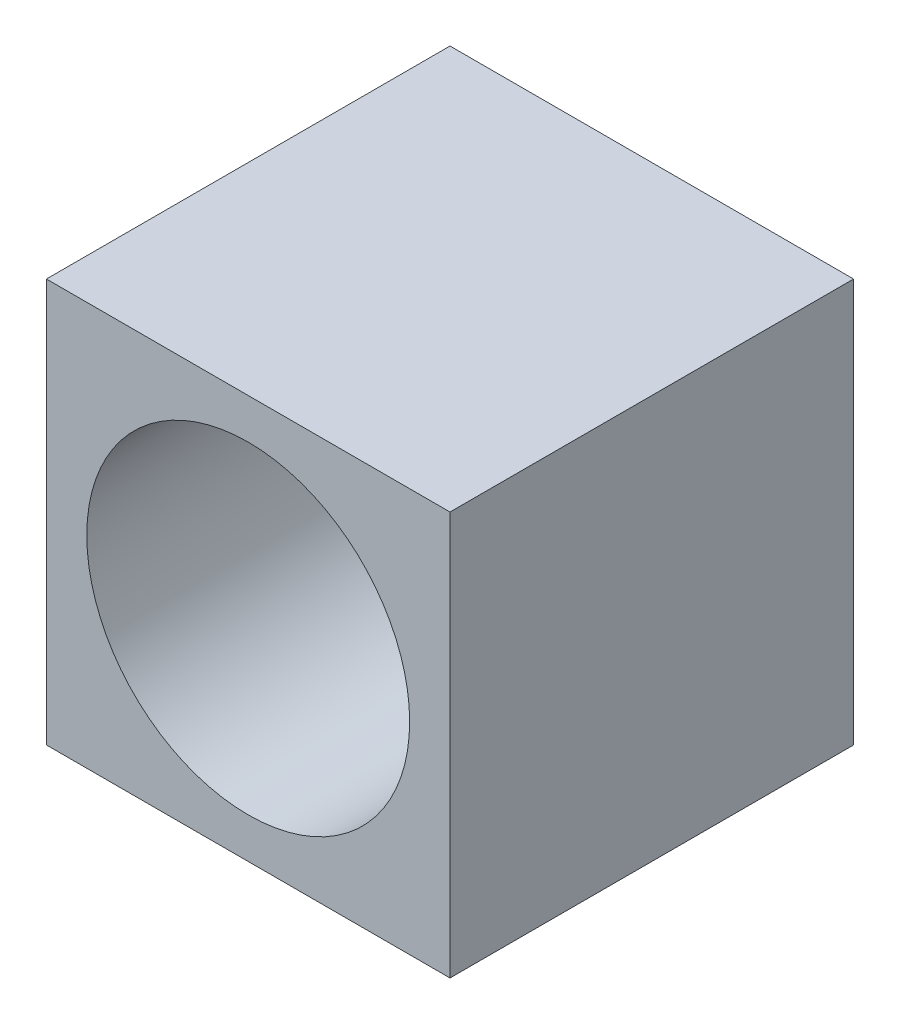
ISO-10303-21;
HEADER;
FILE_DESCRIPTION(('STEP AP214'),'2;1');
FILE_NAME('part.step','',(''),(''),'','','');
FILE_SCHEMA(('AUTOMOTIVE_DESIGN { 1 0 10303 214 1 1 1 1 }'));
ENDSEC;
DATA;
#1=APPLICATION_CONTEXT('core data for automotive mechanical design processes');
#2=APPLICATION_PROTOCOL_DEFINITION('international standard','automotive_design',2000,#1);
#3=PRODUCT_CONTEXT('',#1,'mechanical');
#4=PRODUCT('Part','Part','',(#3));
#5=PRODUCT_RELATED_PRODUCT_CATEGORY('part','',(#4));
#6=PRODUCT_DEFINITION_FORMATION('','',#4);
#7=PRODUCT_DEFINITION_CONTEXT('part definition',#1,'design');
#8=PRODUCT_DEFINITION('design','',#6,#7);
#9=PRODUCT_DEFINITION_SHAPE('','',#8);
#10=(LENGTH_UNIT() NAMED_UNIT(*) SI_UNIT(.MILLI.,.METRE.));
#11=(NAMED_UNIT(*) PLANE_ANGLE_UNIT() SI_UNIT($,.RADIAN.));
#12=(NAMED_UNIT(*) SI_UNIT($,.STERADIAN.) SOLID_ANGLE_UNIT());
#13=UNCERTAINTY_MEASURE_WITH_UNIT(LENGTH_MEASURE(1.E-05),#10,'distance_accuracy_value','');
#14=(GEOMETRIC_REPRESENTATION_CONTEXT(3) GLOBAL_UNCERTAINTY_ASSIGNED_CONTEXT((#13)) GLOBAL_UNIT_ASSIGNED_CONTEXT((#10,
#11,#12)) REPRESENTATION_CONTEXT('',''));
#15=CARTESIAN_POINT('',(0.,0.,0.));
#16=DIRECTION('',(0.,0.,1.));
#17=DIRECTION('',(1.,0.,0.));
#18=AXIS2_PLACEMENT_3D('',#15,#16,#17);
#19=CARTESIAN_POINT('',(0.,0.,10.));
#20=DIRECTION('',(0.,0.,1.));
#21=DIRECTION('',(1.,0.,0.));
#22=AXIS2_PLACEMENT_3D('',#19,#20,#21);
#23=PLANE('',#22);
#24=DIRECTION('',(0.,1.,0.));
#25=VECTOR('',#24,1.);
#26=CARTESIAN_POINT('',(5.,5.,10.));
#27=LINE('',#26,#25);
#28=CARTESIAN_POINT('',(5.,-5.,10.));
#29=VERTEX_POINT('',#28);
#30=CARTESIAN_POINT('',(5.,5.,10.));
#31=VERTEX_POINT('',#30);
#32=EDGE_CURVE('E92',#29,#31,#27,.T.);
#33=ORIENTED_EDGE('',*,*,#32,.T.);
#34=DIRECTION('',(-1.,0.,0.));
#35=VECTOR('',#34,1.);
#36=CARTESIAN_POINT('',(-5.,5.,10.));
#37=LINE('',#36,#35);
#38=CARTESIAN_POINT('',(-5.,5.,10.));
#39=VERTEX_POINT('',#38);
#40=EDGE_CURVE('E87',#31,#39,#37,.T.);
#41=ORIENTED_EDGE('',*,*,#40,.T.);
#42=DIRECTION('',(0.,-1.,0.));
#43=VECTOR('',#42,1.);
#44=CARTESIAN_POINT('',(-5.,5.,10.));
#45=LINE('',#44,#43);
#46=CARTESIAN_POINT('',(-5.,-5.,10.));
#47=VERTEX_POINT('',#46);
#48=EDGE_CURVE('E90',#39,#47,#45,.T.);
#49=ORIENTED_EDGE('',*,*,#48,.T.);
#50=DIRECTION('',(1.,0.,0.));
#51=VECTOR('',#50,1.);
#52=CARTESIAN_POINT('',(-5.,-5.,10.));
#53=LINE('',#52,#51);
#54=EDGE_CURVE('E57',#47,#29,#53,.T.);
#55=ORIENTED_EDGE('',*,*,#54,.T.);
#56=EDGE_LOOP('',(#33,#41,#49,#55));
#57=FACE_BOUND('',#56,.T.);
#58=CARTESIAN_POINT('',(0.,0.,10.));
#59=DIRECTION('',(0.,0.,1.));
#60=DIRECTION('',(1.,0.,0.));
#61=AXIS2_PLACEMENT_3D('',#58,#59,#60);
#62=CIRCLE('',#61,4.);
#63=CARTESIAN_POINT('',(4.,0.,10.));
#64=VERTEX_POINT('',#63);
#65=EDGE_CURVE('E112',#64,#64,#62,.T.);
#66=ORIENTED_EDGE('',*,*,#65,.F.);
#67=EDGE_LOOP('',(#66));
#68=FACE_BOUND('',#67,.T.);
#69=ADVANCED_FACE('F39',(#57,#68),#23,.T.);
#70=CARTESIAN_POINT('',(0.,0.,0.));
#71=DIRECTION('',(0.,0.,1.));
#72=DIRECTION('',(1.,0.,0.));
#73=AXIS2_PLACEMENT_3D('',#70,#71,#72);
#74=PLANE('',#73);
#75=DIRECTION('',(0.,1.,0.));
#76=VECTOR('',#75,1.);
#77=CARTESIAN_POINT('',(5.,5.,0.));
#78=LINE('',#77,#76);
#79=CARTESIAN_POINT('',(5.,-5.,0.));
#80=VERTEX_POINT('',#79);
#81=CARTESIAN_POINT('',(5.,5.,0.));
#82=VERTEX_POINT('',#81);
#83=EDGE_CURVE('E108',#80,#82,#78,.T.);
#84=ORIENTED_EDGE('',*,*,#83,.F.);
#85=DIRECTION('',(1.,0.,0.));
#86=VECTOR('',#85,1.);
#87=CARTESIAN_POINT('',(-5.,-5.,0.));
#88=LINE('',#87,#86);
#89=CARTESIAN_POINT('',(-5.,-5.,0.));
#90=VERTEX_POINT('',#89);
#91=EDGE_CURVE('E80',#90,#80,#88,.T.);
#92=ORIENTED_EDGE('',*,*,#91,.F.);
#93=DIRECTION('',(0.,-1.,0.));
#94=VECTOR('',#93,1.);
#95=CARTESIAN_POINT('',(-5.,5.,0.));
#96=LINE('',#95,#94);
#97=CARTESIAN_POINT('',(-5.,5.,0.));
#98=VERTEX_POINT('',#97);
#99=EDGE_CURVE('E74',#98,#90,#96,.T.);
#100=ORIENTED_EDGE('',*,*,#99,.F.);
#101=DIRECTION('',(-1.,0.,0.));
#102=VECTOR('',#101,1.);
#103=CARTESIAN_POINT('',(-5.,5.,0.));
#104=LINE('',#103,#102);
#105=EDGE_CURVE('E97',#82,#98,#104,.T.);
#106=ORIENTED_EDGE('',*,*,#105,.F.);
#107=EDGE_LOOP('',(#84,#92,#100,#106));
#108=FACE_BOUND('',#107,.T.);
#109=CARTESIAN_POINT('',(0.,0.,0.));
#110=DIRECTION('',(0.,0.,1.));
#111=DIRECTION('',(1.,0.,0.));
#112=AXIS2_PLACEMENT_3D('',#109,#110,#111);
#113=CIRCLE('',#112,4.);
#114=CARTESIAN_POINT('',(4.,0.,0.));
#115=VERTEX_POINT('',#114);
#116=EDGE_CURVE('E130',#115,#115,#113,.T.);
#117=ORIENTED_EDGE('',*,*,#116,.T.);
#118=EDGE_LOOP('',(#117));
#119=FACE_BOUND('',#118,.T.);
#120=ADVANCED_FACE('F125',(#108,#119),#74,.F.);
#121=CARTESIAN_POINT('',(5.,5.,10.));
#122=DIRECTION('',(-1.,0.,0.));
#123=DIRECTION('',(0.,0.,1.));
#124=AXIS2_PLACEMENT_3D('',#121,#122,#123);
#125=PLANE('',#124);
#126=ORIENTED_EDGE('',*,*,#83,.T.);
#127=DIRECTION('',(0.,0.,-1.));
#128=VECTOR('',#127,1.);
#129=CARTESIAN_POINT('',(5.,5.,10.));
#130=LINE('',#129,#128);
#131=EDGE_CURVE('E11',#31,#82,#130,.T.);
#132=ORIENTED_EDGE('',*,*,#131,.F.);
#133=ORIENTED_EDGE('',*,*,#32,.F.);
#134=DIRECTION('',(0.,0.,-1.));
#135=VECTOR('',#134,1.);
#136=CARTESIAN_POINT('',(5.,-5.,10.));
#137=LINE('',#136,#135);
#138=EDGE_CURVE('E104',#29,#80,#137,.T.);
#139=ORIENTED_EDGE('',*,*,#138,.T.);
#140=EDGE_LOOP('',(#126,#132,#133,#139));
#141=FACE_BOUND('',#140,.T.);
#142=ADVANCED_FACE('F41',(#141),#125,.F.);
#143=CARTESIAN_POINT('',(-5.,5.,10.));
#144=DIRECTION('',(0.,-1.,0.));
#145=DIRECTION('',(0.,0.,-1.));
#146=AXIS2_PLACEMENT_3D('',#143,#144,#145);
#147=PLANE('',#146);
#148=ORIENTED_EDGE('',*,*,#105,.T.);
#149=DIRECTION('',(0.,0.,-1.));
#150=VECTOR('',#149,1.);
#151=CARTESIAN_POINT('',(-5.,5.,10.));
#152=LINE('',#151,#150);
#153=EDGE_CURVE('E49',#39,#98,#152,.T.);
#154=ORIENTED_EDGE('',*,*,#153,.F.);
#155=ORIENTED_EDGE('',*,*,#40,.F.);
#156=ORIENTED_EDGE('',*,*,#131,.T.);
#157=EDGE_LOOP('',(#148,#154,#155,#156));
#158=FACE_BOUND('',#157,.T.);
#159=ADVANCED_FACE('F96',(#158),#147,.F.);
#160=CARTESIAN_POINT('',(-5.,5.,10.));
#161=DIRECTION('',(1.,0.,0.));
#162=DIRECTION('',(0.,0.,-1.));
#163=AXIS2_PLACEMENT_3D('',#160,#161,#162);
#164=PLANE('',#163);
#165=ORIENTED_EDGE('',*,*,#99,.T.);
#166=DIRECTION('',(0.,0.,-1.));
#167=VECTOR('',#166,1.);
#168=CARTESIAN_POINT('',(-5.,-5.,10.));
#169=LINE('',#168,#167);
#170=EDGE_CURVE('E99',#47,#90,#169,.T.);
#171=ORIENTED_EDGE('',*,*,#170,.F.);
#172=ORIENTED_EDGE('',*,*,#48,.F.);
#173=ORIENTED_EDGE('',*,*,#153,.T.);
#174=EDGE_LOOP('',(#165,#171,#172,#173));
#175=FACE_BOUND('',#174,.T.);
#176=ADVANCED_FACE('F100',(#175),#164,.F.);
#177=CARTESIAN_POINT('',(-5.,-5.,10.));
#178=DIRECTION('',(0.,1.,0.));
#179=DIRECTION('',(0.,0.,1.));
#180=AXIS2_PLACEMENT_3D('',#177,#178,#179);
#181=PLANE('',#180);
#182=ORIENTED_EDGE('',*,*,#91,.T.);
#183=ORIENTED_EDGE('',*,*,#138,.F.);
#184=ORIENTED_EDGE('',*,*,#54,.F.);
#185=ORIENTED_EDGE('',*,*,#170,.T.);
#186=EDGE_LOOP('',(#182,#183,#184,#185));
#187=FACE_BOUND('',#186,.T.);
#188=ADVANCED_FACE('F122',(#187),#181,.F.);
#189=CARTESIAN_POINT('',(0.,0.,10.));
#190=DIRECTION('',(0.,0.,-1.));
#191=DIRECTION('',(-1.,0.,0.));
#192=AXIS2_PLACEMENT_3D('',#189,#190,#191);
#193=CYLINDRICAL_SURFACE('',#192,4.);
#194=ORIENTED_EDGE('',*,*,#65,.T.);
#195=EDGE_LOOP('',(#194));
#196=FACE_BOUND('',#195,.T.);
#197=ORIENTED_EDGE('',*,*,#116,.F.);
#198=EDGE_LOOP('',(#197));
#199=FACE_BOUND('',#198,.T.);
#200=ADVANCED_FACE('F138',(#196,#199),#193,.F.);
#201=CLOSED_SHELL('',(#69,#120,#142,#159,#176,#188,#200));
#202=MANIFOLD_SOLID_BREP('B2',#201);
#203=ADVANCED_BREP_SHAPE_REPRESENTATION('',(#18,#202),#14);
#204=SHAPE_DEFINITION_REPRESENTATION(#9,#203);
ENDSEC;
END-ISO-10303-21;
